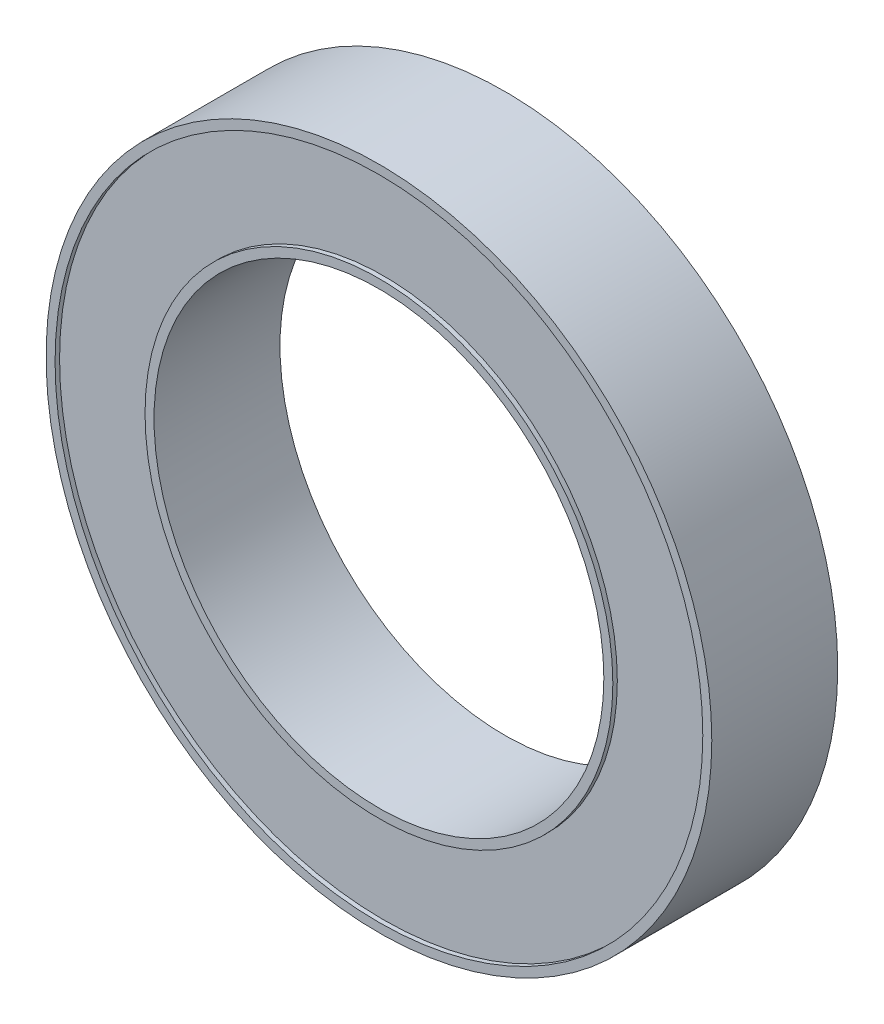
ISO-10303-21;
HEADER;
FILE_DESCRIPTION(('STEP AP214'),'2;1');
FILE_NAME('part.step','',(''),(''),'','','');
FILE_SCHEMA(('AUTOMOTIVE_DESIGN { 1 0 10303 214 1 1 1 1 }'));
ENDSEC;
DATA;
#1=APPLICATION_CONTEXT('core data for automotive mechanical design processes');
#2=APPLICATION_PROTOCOL_DEFINITION('international standard','automotive_design',2000,#1);
#3=PRODUCT_CONTEXT('',#1,'mechanical');
#4=PRODUCT('Part','Part','',(#3));
#5=PRODUCT_RELATED_PRODUCT_CATEGORY('part','',(#4));
#6=PRODUCT_DEFINITION_FORMATION('','',#4);
#7=PRODUCT_DEFINITION_CONTEXT('part definition',#1,'design');
#8=PRODUCT_DEFINITION('design','',#6,#7);
#9=PRODUCT_DEFINITION_SHAPE('','',#8);
#10=(LENGTH_UNIT() NAMED_UNIT(*) SI_UNIT(.MILLI.,.METRE.));
#11=(NAMED_UNIT(*) PLANE_ANGLE_UNIT() SI_UNIT($,.RADIAN.));
#12=(NAMED_UNIT(*) SI_UNIT($,.STERADIAN.) SOLID_ANGLE_UNIT());
#13=UNCERTAINTY_MEASURE_WITH_UNIT(LENGTH_MEASURE(1.E-05),#10,'distance_accuracy_value','');
#14=(GEOMETRIC_REPRESENTATION_CONTEXT(3) GLOBAL_UNCERTAINTY_ASSIGNED_CONTEXT((#13)) GLOBAL_UNIT_ASSIGNED_CONTEXT((#10,
#11,#12)) REPRESENTATION_CONTEXT('',''));
#15=CARTESIAN_POINT('',(0.,0.,0.));
#16=DIRECTION('',(0.,0.,1.));
#17=DIRECTION('',(1.,0.,0.));
#18=AXIS2_PLACEMENT_3D('',#15,#16,#17);
#19=CARTESIAN_POINT('',(0.,0.,-3.5));
#20=DIRECTION('',(0.,0.,1.));
#21=DIRECTION('',(1.,0.,0.));
#22=AXIS2_PLACEMENT_3D('',#19,#20,#21);
#23=PLANE('',#22);
#24=CARTESIAN_POINT('',(0.,0.,-3.5));
#25=DIRECTION('',(0.,0.,1.));
#26=DIRECTION('',(1.,0.,0.));
#27=AXIS2_PLACEMENT_3D('',#24,#25,#26);
#28=CIRCLE('',#27,12.5);
#29=CARTESIAN_POINT('',(12.5,0.,-3.5));
#30=VERTEX_POINT('',#29);
#31=EDGE_CURVE('E60',#30,#30,#28,.T.);
#32=ORIENTED_EDGE('',*,*,#31,.T.);
#33=EDGE_LOOP('',(#32));
#34=FACE_BOUND('',#33,.T.);
#35=CARTESIAN_POINT('',(0.,0.,-3.5));
#36=DIRECTION('',(0.,0.,1.));
#37=DIRECTION('',(1.,0.,0.));
#38=AXIS2_PLACEMENT_3D('',#35,#36,#37);
#39=CIRCLE('',#38,13.);
#40=CARTESIAN_POINT('',(13.,0.,-3.5));
#41=VERTEX_POINT('',#40);
#42=EDGE_CURVE('E84',#41,#41,#39,.T.);
#43=ORIENTED_EDGE('',*,*,#42,.F.);
#44=EDGE_LOOP('',(#43));
#45=FACE_BOUND('',#44,.T.);
#46=ADVANCED_FACE('F47',(#34,#45),#23,.F.);
#47=CARTESIAN_POINT('',(0.,0.,3.5));
#48=DIRECTION('',(0.,0.,1.));
#49=DIRECTION('',(1.,0.,0.));
#50=AXIS2_PLACEMENT_3D('',#47,#48,#49);
#51=PLANE('',#50);
#52=CARTESIAN_POINT('',(0.,0.,3.5));
#53=DIRECTION('',(0.,0.,1.));
#54=DIRECTION('',(1.,0.,0.));
#55=AXIS2_PLACEMENT_3D('',#52,#53,#54);
#56=CIRCLE('',#55,12.5);
#57=CARTESIAN_POINT('',(12.5,0.,3.5));
#58=VERTEX_POINT('',#57);
#59=EDGE_CURVE('E58',#58,#58,#56,.T.);
#60=ORIENTED_EDGE('',*,*,#59,.F.);
#61=EDGE_LOOP('',(#60));
#62=FACE_BOUND('',#61,.T.);
#63=CARTESIAN_POINT('',(0.,0.,3.5));
#64=DIRECTION('',(0.,0.,1.));
#65=DIRECTION('',(1.,0.,0.));
#66=AXIS2_PLACEMENT_3D('',#63,#64,#65);
#67=CIRCLE('',#66,13.);
#68=CARTESIAN_POINT('',(13.,0.,3.5));
#69=VERTEX_POINT('',#68);
#70=EDGE_CURVE('E72',#69,#69,#67,.T.);
#71=ORIENTED_EDGE('',*,*,#70,.T.);
#72=EDGE_LOOP('',(#71));
#73=FACE_BOUND('',#72,.T.);
#74=ADVANCED_FACE('F100',(#62,#73),#51,.T.);
#75=CARTESIAN_POINT('',(0.,0.,3.5));
#76=DIRECTION('',(0.,0.,1.));
#77=DIRECTION('',(1.,0.,0.));
#78=AXIS2_PLACEMENT_3D('',#75,#76,#77);
#79=CIRCLE('',#78,18.);
#80=CARTESIAN_POINT('',(18.,0.,3.5));
#81=VERTEX_POINT('',#80);
#82=EDGE_CURVE('E66',#81,#81,#79,.T.);
#83=ORIENTED_EDGE('',*,*,#82,.F.);
#84=EDGE_LOOP('',(#83));
#85=FACE_BOUND('',#84,.T.);
#86=CARTESIAN_POINT('',(0.,0.,3.5));
#87=DIRECTION('',(0.,0.,1.));
#88=DIRECTION('',(1.,0.,0.));
#89=AXIS2_PLACEMENT_3D('',#86,#87,#88);
#90=CIRCLE('',#89,18.5);
#91=CARTESIAN_POINT('',(18.5,0.,3.5));
#92=VERTEX_POINT('',#91);
#93=EDGE_CURVE('E11',#92,#92,#90,.T.);
#94=ORIENTED_EDGE('',*,*,#93,.T.);
#95=EDGE_LOOP('',(#94));
#96=FACE_BOUND('',#95,.T.);
#97=ADVANCED_FACE('F106',(#85,#96),#51,.T.);
#98=CARTESIAN_POINT('',(0.,0.,-3.5));
#99=DIRECTION('',(0.,0.,1.));
#100=DIRECTION('',(1.,0.,0.));
#101=AXIS2_PLACEMENT_3D('',#98,#99,#100);
#102=CIRCLE('',#101,18.);
#103=CARTESIAN_POINT('',(18.,0.,-3.5));
#104=VERTEX_POINT('',#103);
#105=EDGE_CURVE('E78',#104,#104,#102,.T.);
#106=ORIENTED_EDGE('',*,*,#105,.T.);
#107=EDGE_LOOP('',(#106));
#108=FACE_BOUND('',#107,.T.);
#109=CARTESIAN_POINT('',(0.,0.,-3.5));
#110=DIRECTION('',(0.,0.,1.));
#111=DIRECTION('',(1.,0.,0.));
#112=AXIS2_PLACEMENT_3D('',#109,#110,#111);
#113=CIRCLE('',#112,18.5);
#114=CARTESIAN_POINT('',(18.5,0.,-3.5));
#115=VERTEX_POINT('',#114);
#116=EDGE_CURVE('E51',#115,#115,#113,.T.);
#117=ORIENTED_EDGE('',*,*,#116,.F.);
#118=EDGE_LOOP('',(#117));
#119=FACE_BOUND('',#118,.T.);
#120=ADVANCED_FACE('F102',(#108,#119),#23,.F.);
#121=CARTESIAN_POINT('',(0.,0.,3.5));
#122=DIRECTION('',(0.,0.,-1.));
#123=DIRECTION('',(-1.,0.,0.));
#124=AXIS2_PLACEMENT_3D('',#121,#122,#123);
#125=CYLINDRICAL_SURFACE('',#124,18.5);
#126=ORIENTED_EDGE('',*,*,#93,.F.);
#127=EDGE_LOOP('',(#126));
#128=FACE_BOUND('',#127,.T.);
#129=ORIENTED_EDGE('',*,*,#116,.T.);
#130=EDGE_LOOP('',(#129));
#131=FACE_BOUND('',#130,.T.);
#132=ADVANCED_FACE('F49',(#128,#131),#125,.T.);
#133=CARTESIAN_POINT('',(0.,0.,3.5));
#134=DIRECTION('',(0.,0.,-1.));
#135=DIRECTION('',(-1.,0.,0.));
#136=AXIS2_PLACEMENT_3D('',#133,#134,#135);
#137=CYLINDRICAL_SURFACE('',#136,12.5);
#138=ORIENTED_EDGE('',*,*,#59,.T.);
#139=EDGE_LOOP('',(#138));
#140=FACE_BOUND('',#139,.T.);
#141=ORIENTED_EDGE('',*,*,#31,.F.);
#142=EDGE_LOOP('',(#141));
#143=FACE_BOUND('',#142,.T.);
#144=ADVANCED_FACE('F115',(#140,#143),#137,.F.);
#145=CARTESIAN_POINT('',(0.,0.,3.25));
#146=DIRECTION('',(0.,0.,1.));
#147=DIRECTION('',(1.,0.,0.));
#148=AXIS2_PLACEMENT_3D('',#145,#146,#147);
#149=CYLINDRICAL_SURFACE('',#148,18.);
#150=CARTESIAN_POINT('',(0.,0.,3.25));
#151=DIRECTION('',(0.,0.,1.));
#152=DIRECTION('',(1.,0.,0.));
#153=AXIS2_PLACEMENT_3D('',#150,#151,#152);
#154=CIRCLE('',#153,18.);
#155=CARTESIAN_POINT('',(18.,0.,3.25));
#156=VERTEX_POINT('',#155);
#157=EDGE_CURVE('E63',#156,#156,#154,.T.);
#158=ORIENTED_EDGE('',*,*,#157,.F.);
#159=EDGE_LOOP('',(#158));
#160=FACE_BOUND('',#159,.T.);
#161=ORIENTED_EDGE('',*,*,#82,.T.);
#162=EDGE_LOOP('',(#161));
#163=FACE_BOUND('',#162,.T.);
#164=ADVANCED_FACE('F139',(#160,#163),#149,.F.);
#165=CARTESIAN_POINT('',(0.,0.,3.25));
#166=DIRECTION('',(0.,0.,1.));
#167=DIRECTION('',(1.,0.,0.));
#168=AXIS2_PLACEMENT_3D('',#165,#166,#167);
#169=PLANE('',#168);
#170=CARTESIAN_POINT('',(0.,0.,3.25));
#171=DIRECTION('',(0.,0.,1.));
#172=DIRECTION('',(1.,0.,0.));
#173=AXIS2_PLACEMENT_3D('',#170,#171,#172);
#174=CIRCLE('',#173,13.);
#175=CARTESIAN_POINT('',(13.,0.,3.25));
#176=VERTEX_POINT('',#175);
#177=EDGE_CURVE('E69',#176,#176,#174,.T.);
#178=ORIENTED_EDGE('',*,*,#177,.F.);
#179=EDGE_LOOP('',(#178));
#180=FACE_BOUND('',#179,.T.);
#181=ORIENTED_EDGE('',*,*,#157,.T.);
#182=EDGE_LOOP('',(#181));
#183=FACE_BOUND('',#182,.T.);
#184=ADVANCED_FACE('F135',(#180,#183),#169,.T.);
#185=CARTESIAN_POINT('',(0.,0.,3.25));
#186=DIRECTION('',(0.,0.,1.));
#187=DIRECTION('',(1.,0.,0.));
#188=AXIS2_PLACEMENT_3D('',#185,#186,#187);
#189=CYLINDRICAL_SURFACE('',#188,13.);
#190=ORIENTED_EDGE('',*,*,#177,.T.);
#191=EDGE_LOOP('',(#190));
#192=FACE_BOUND('',#191,.T.);
#193=ORIENTED_EDGE('',*,*,#70,.F.);
#194=EDGE_LOOP('',(#193));
#195=FACE_BOUND('',#194,.T.);
#196=ADVANCED_FACE('F129',(#192,#195),#189,.T.);
#197=CARTESIAN_POINT('',(0.,0.,-3.25));
#198=DIRECTION('',(0.,0.,-1.));
#199=DIRECTION('',(1.,0.,0.));
#200=AXIS2_PLACEMENT_3D('',#197,#198,#199);
#201=PLANE('',#200);
#202=CARTESIAN_POINT('',(0.,0.,-3.25));
#203=DIRECTION('',(0.,0.,1.));
#204=DIRECTION('',(1.,0.,0.));
#205=AXIS2_PLACEMENT_3D('',#202,#203,#204);
#206=CIRCLE('',#205,18.);
#207=CARTESIAN_POINT('',(18.,0.,-3.25));
#208=VERTEX_POINT('',#207);
#209=EDGE_CURVE('E75',#208,#208,#206,.T.);
#210=ORIENTED_EDGE('',*,*,#209,.F.);
#211=EDGE_LOOP('',(#210));
#212=FACE_BOUND('',#211,.T.);
#213=CARTESIAN_POINT('',(0.,0.,-3.25));
#214=DIRECTION('',(0.,0.,1.));
#215=DIRECTION('',(1.,0.,0.));
#216=AXIS2_PLACEMENT_3D('',#213,#214,#215);
#217=CIRCLE('',#216,13.);
#218=CARTESIAN_POINT('',(13.,0.,-3.25));
#219=VERTEX_POINT('',#218);
#220=EDGE_CURVE('E81',#219,#219,#217,.T.);
#221=ORIENTED_EDGE('',*,*,#220,.T.);
#222=EDGE_LOOP('',(#221));
#223=FACE_BOUND('',#222,.T.);
#224=ADVANCED_FACE('F90',(#212,#223),#201,.T.);
#225=CARTESIAN_POINT('',(0.,0.,-3.25));
#226=DIRECTION('',(0.,0.,-1.));
#227=DIRECTION('',(-1.,0.,0.));
#228=AXIS2_PLACEMENT_3D('',#225,#226,#227);
#229=CYLINDRICAL_SURFACE('',#228,18.);
#230=ORIENTED_EDGE('',*,*,#209,.T.);
#231=EDGE_LOOP('',(#230));
#232=FACE_BOUND('',#231,.T.);
#233=ORIENTED_EDGE('',*,*,#105,.F.);
#234=EDGE_LOOP('',(#233));
#235=FACE_BOUND('',#234,.T.);
#236=ADVANCED_FACE('F95',(#232,#235),#229,.F.);
#237=CARTESIAN_POINT('',(0.,0.,-3.25));
#238=DIRECTION('',(0.,0.,-1.));
#239=DIRECTION('',(-1.,0.,0.));
#240=AXIS2_PLACEMENT_3D('',#237,#238,#239);
#241=CYLINDRICAL_SURFACE('',#240,13.);
#242=ORIENTED_EDGE('',*,*,#220,.F.);
#243=EDGE_LOOP('',(#242));
#244=FACE_BOUND('',#243,.T.);
#245=ORIENTED_EDGE('',*,*,#42,.T.);
#246=EDGE_LOOP('',(#245));
#247=FACE_BOUND('',#246,.T.);
#248=ADVANCED_FACE('F92',(#244,#247),#241,.T.);
#249=CLOSED_SHELL('',(#46,#74,#97,#120,#132,#144,#164,#184,#196,#224,#236,#248));
#250=MANIFOLD_SOLID_BREP('B2',#249);
#251=ADVANCED_BREP_SHAPE_REPRESENTATION('',(#18,#250),#14);
#252=SHAPE_DEFINITION_REPRESENTATION(#9,#251);
ENDSEC;
END-ISO-10303-21;
